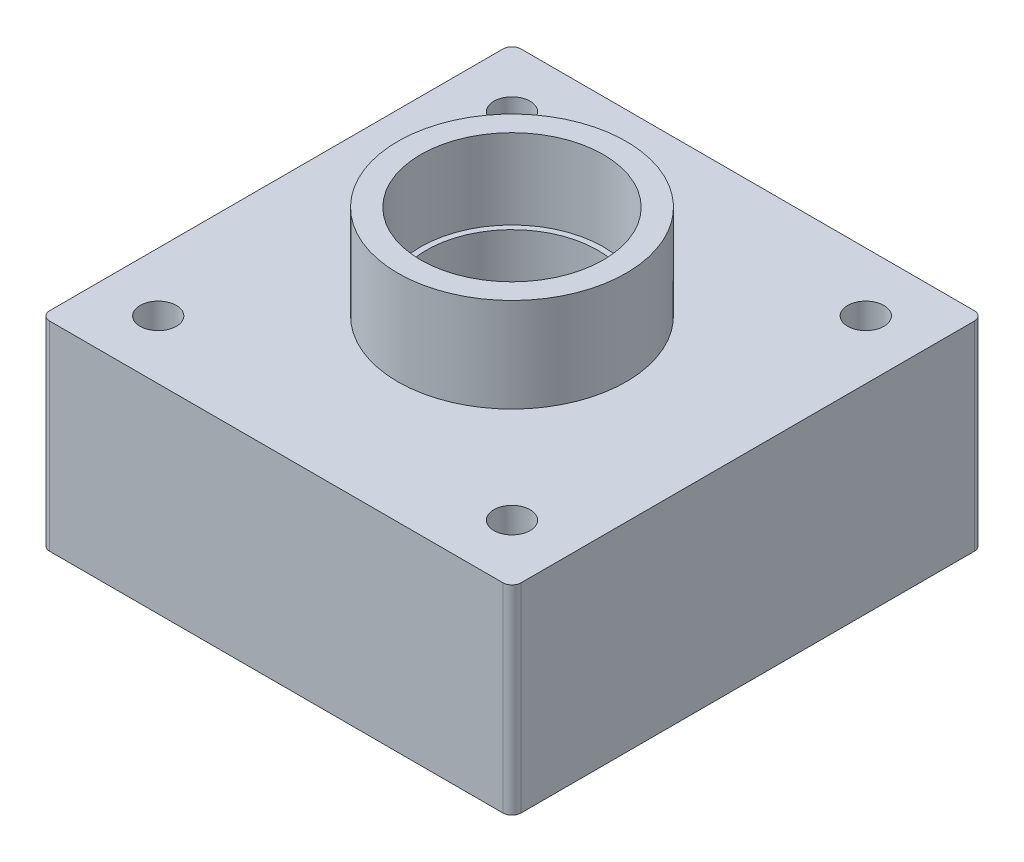
ISO-10303-21;
HEADER;
FILE_DESCRIPTION(('STEP AP214'),'2;1');
FILE_NAME('part.step','',(''),(''),'','','');
FILE_SCHEMA(('AUTOMOTIVE_DESIGN { 1 0 10303 214 1 1 1 1 }'));
ENDSEC;
DATA;
#1=APPLICATION_CONTEXT('core data for automotive mechanical design processes');
#2=APPLICATION_PROTOCOL_DEFINITION('international standard','automotive_design',2000,#1);
#3=PRODUCT_CONTEXT('',#1,'mechanical');
#4=PRODUCT('Part','Part','',(#3));
#5=PRODUCT_RELATED_PRODUCT_CATEGORY('part','',(#4));
#6=PRODUCT_DEFINITION_FORMATION('','',#4);
#7=PRODUCT_DEFINITION_CONTEXT('part definition',#1,'design');
#8=PRODUCT_DEFINITION('design','',#6,#7);
#9=PRODUCT_DEFINITION_SHAPE('','',#8);
#10=(LENGTH_UNIT() NAMED_UNIT(*) SI_UNIT(.MILLI.,.METRE.));
#11=(NAMED_UNIT(*) PLANE_ANGLE_UNIT() SI_UNIT($,.RADIAN.));
#12=(NAMED_UNIT(*) SI_UNIT($,.STERADIAN.) SOLID_ANGLE_UNIT());
#13=UNCERTAINTY_MEASURE_WITH_UNIT(LENGTH_MEASURE(1.E-05),#10,'distance_accuracy_value','');
#14=(GEOMETRIC_REPRESENTATION_CONTEXT(3) GLOBAL_UNCERTAINTY_ASSIGNED_CONTEXT((#13)) GLOBAL_UNIT_ASSIGNED_CONTEXT((#10,
#11,#12)) REPRESENTATION_CONTEXT('',''));
#15=CARTESIAN_POINT('',(0.,0.,0.));
#16=DIRECTION('',(0.,0.,1.));
#17=DIRECTION('',(1.,0.,0.));
#18=AXIS2_PLACEMENT_3D('',#15,#16,#17);
#19=CARTESIAN_POINT('',(0.,0.,0.));
#20=DIRECTION('',(0.,1.,0.));
#21=DIRECTION('',(0.,0.,1.));
#22=AXIS2_PLACEMENT_3D('',#19,#20,#21);
#23=PLANE('',#22);
#24=CARTESIAN_POINT('',(-50.55,0.,0.));
#25=DIRECTION('',(0.,-1.,0.));
#26=DIRECTION('',(0.,0.,-1.));
#27=AXIS2_PLACEMENT_3D('',#24,#25,#26);
#28=CIRCLE('',#27,6.35);
#29=CARTESIAN_POINT('',(-50.55,0.,-6.35));
#30=VERTEX_POINT('',#29);
#31=EDGE_CURVE('E266',#30,#30,#28,.T.);
#32=ORIENTED_EDGE('',*,*,#31,.F.);
#33=EDGE_LOOP('',(#32));
#34=FACE_BOUND('',#33,.T.);
#35=CARTESIAN_POINT('',(0.,0.,0.));
#36=DIRECTION('',(0.,1.,0.));
#37=DIRECTION('',(0.,0.,1.));
#38=AXIS2_PLACEMENT_3D('',#35,#36,#37);
#39=CIRCLE('',#38,20.);
#40=CARTESIAN_POINT('',(0.,0.,20.));
#41=VERTEX_POINT('',#40);
#42=EDGE_CURVE('E225',#41,#41,#39,.T.);
#43=ORIENTED_EDGE('',*,*,#42,.T.);
#44=EDGE_LOOP('',(#43));
#45=FACE_BOUND('',#44,.T.);
#46=CARTESIAN_POINT('',(0.,0.,0.));
#47=DIRECTION('',(0.,1.,0.));
#48=DIRECTION('',(0.,0.,1.));
#49=AXIS2_PLACEMENT_3D('',#46,#47,#48);
#50=CIRCLE('',#49,69.85);
#51=CARTESIAN_POINT('',(0.,0.,69.85));
#52=VERTEX_POINT('',#51);
#53=EDGE_CURVE('E235',#52,#52,#50,.T.);
#54=ORIENTED_EDGE('',*,*,#53,.F.);
#55=EDGE_LOOP('',(#54));
#56=FACE_BOUND('',#55,.T.);
#57=ADVANCED_FACE('F49',(#34,#45,#56),#23,.F.);
#58=CARTESIAN_POINT('',(0.,40.,0.));
#59=DIRECTION('',(0.,-1.,0.));
#60=DIRECTION('',(0.,0.,-1.));
#61=AXIS2_PLACEMENT_3D('',#58,#59,#60);
#62=CYLINDRICAL_SURFACE('',#61,20.);
#63=CARTESIAN_POINT('',(0.,40.,0.));
#64=DIRECTION('',(0.,1.,0.));
#65=DIRECTION('',(0.,0.,1.));
#66=AXIS2_PLACEMENT_3D('',#63,#64,#65);
#67=CIRCLE('',#66,20.);
#68=CARTESIAN_POINT('',(0.,40.,20.));
#69=VERTEX_POINT('',#68);
#70=EDGE_CURVE('E159',#69,#69,#67,.T.);
#71=ORIENTED_EDGE('',*,*,#70,.T.);
#72=EDGE_LOOP('',(#71));
#73=FACE_BOUND('',#72,.T.);
#74=ORIENTED_EDGE('',*,*,#42,.F.);
#75=EDGE_LOOP('',(#74));
#76=FACE_BOUND('',#75,.T.);
#77=ADVANCED_FACE('F329',(#73,#76),#62,.F.);
#78=CARTESIAN_POINT('',(0.,40.,0.));
#79=DIRECTION('',(0.,1.,0.));
#80=DIRECTION('',(0.,0.,1.));
#81=AXIS2_PLACEMENT_3D('',#78,#79,#80);
#82=PLANE('',#81);
#83=ORIENTED_EDGE('',*,*,#70,.F.);
#84=EDGE_LOOP('',(#83));
#85=FACE_BOUND('',#84,.T.);
#86=ADVANCED_FACE('F325',(#85),#82,.F.);
#87=CARTESIAN_POINT('',(0.,8.,0.));
#88=DIRECTION('',(0.,-1.,0.));
#89=DIRECTION('',(0.,0.,-1.));
#90=AXIS2_PLACEMENT_3D('',#87,#88,#89);
#91=CYLINDRICAL_SURFACE('',#90,69.85);
#92=CARTESIAN_POINT('',(0.,8.,0.));
#93=DIRECTION('',(0.,1.,0.));
#94=DIRECTION('',(0.,0.,1.));
#95=AXIS2_PLACEMENT_3D('',#92,#93,#94);
#96=CIRCLE('',#95,69.85);
#97=CARTESIAN_POINT('',(0.,8.,69.85));
#98=VERTEX_POINT('',#97);
#99=EDGE_CURVE('E234',#98,#98,#96,.T.);
#100=ORIENTED_EDGE('',*,*,#99,.F.);
#101=EDGE_LOOP('',(#100));
#102=FACE_BOUND('',#101,.T.);
#103=ORIENTED_EDGE('',*,*,#53,.T.);
#104=EDGE_LOOP('',(#103));
#105=FACE_BOUND('',#104,.T.);
#106=ADVANCED_FACE('F321',(#102,#105),#91,.T.);
#107=CARTESIAN_POINT('',(0.,8.,0.));
#108=DIRECTION('',(0.,-1.,0.));
#109=DIRECTION('',(0.,0.,-1.));
#110=AXIS2_PLACEMENT_3D('',#107,#108,#109);
#111=CYLINDRICAL_SURFACE('',#110,76.2);
#112=CARTESIAN_POINT('',(0.,8.,0.));
#113=DIRECTION('',(0.,1.,0.));
#114=DIRECTION('',(0.,0.,1.));
#115=AXIS2_PLACEMENT_3D('',#112,#113,#114);
#116=CIRCLE('',#115,76.2);
#117=CARTESIAN_POINT('',(0.,8.,76.2));
#118=VERTEX_POINT('',#117);
#119=EDGE_CURVE('E228',#118,#118,#116,.T.);
#120=ORIENTED_EDGE('',*,*,#119,.T.);
#121=EDGE_LOOP('',(#120));
#122=FACE_BOUND('',#121,.T.);
#123=CARTESIAN_POINT('',(0.,0.,0.));
#124=DIRECTION('',(0.,1.,0.));
#125=DIRECTION('',(0.,0.,1.));
#126=AXIS2_PLACEMENT_3D('',#123,#124,#125);
#127=CIRCLE('',#126,76.2);
#128=CARTESIAN_POINT('',(0.,0.,76.2));
#129=VERTEX_POINT('',#128);
#130=EDGE_CURVE('E231',#129,#129,#127,.T.);
#131=ORIENTED_EDGE('',*,*,#130,.F.);
#132=EDGE_LOOP('',(#131));
#133=FACE_BOUND('',#132,.T.);
#134=ADVANCED_FACE('F317',(#122,#133),#111,.F.);
#135=CARTESIAN_POINT('',(0.,8.,0.));
#136=DIRECTION('',(0.,1.,0.));
#137=DIRECTION('',(0.,0.,1.));
#138=AXIS2_PLACEMENT_3D('',#135,#136,#137);
#139=PLANE('',#138);
#140=ORIENTED_EDGE('',*,*,#99,.T.);
#141=EDGE_LOOP('',(#140));
#142=FACE_BOUND('',#141,.T.);
#143=ORIENTED_EDGE('',*,*,#119,.F.);
#144=EDGE_LOOP('',(#143));
#145=FACE_BOUND('',#144,.T.);
#146=ADVANCED_FACE('F314',(#142,#145),#139,.F.);
#147=CARTESIAN_POINT('',(0.,69.85,0.));
#148=DIRECTION('',(0.,1.,0.));
#149=DIRECTION('',(0.,0.,1.));
#150=AXIS2_PLACEMENT_3D('',#147,#148,#149);
#151=PLANE('',#150);
#152=CARTESIAN_POINT('',(0.,69.85,0.));
#153=DIRECTION('',(0.,1.,0.));
#154=DIRECTION('',(0.,0.,1.));
#155=AXIS2_PLACEMENT_3D('',#152,#153,#154);
#156=CIRCLE('',#155,40.);
#157=CARTESIAN_POINT('',(0.,69.85,40.));
#158=VERTEX_POINT('',#157);
#159=EDGE_CURVE('E243',#158,#158,#156,.T.);
#160=ORIENTED_EDGE('',*,*,#159,.F.);
#161=EDGE_LOOP('',(#160));
#162=FACE_BOUND('',#161,.T.);
#163=CARTESIAN_POINT('',(79.375,69.85,-79.375));
#164=DIRECTION('',(0.,1.,0.));
#165=DIRECTION('',(0.,0.,1.));
#166=AXIS2_PLACEMENT_3D('',#163,#164,#165);
#167=CIRCLE('',#166,3.175);
#168=CARTESIAN_POINT('',(79.375,69.85,-82.55));
#169=VERTEX_POINT('',#168);
#170=CARTESIAN_POINT('',(82.55,69.85,-79.375));
#171=VERTEX_POINT('',#170);
#172=EDGE_CURVE('E187',#169,#171,#167,.F.);
#173=ORIENTED_EDGE('',*,*,#172,.F.);
#174=DIRECTION('',(1.,0.,0.));
#175=VECTOR('',#174,1.);
#176=CARTESIAN_POINT('',(0.,69.85,-82.55));
#177=LINE('',#176,#175);
#178=CARTESIAN_POINT('',(-79.375,69.85,-82.55));
#179=VERTEX_POINT('',#178);
#180=EDGE_CURVE('E214',#179,#169,#177,.T.);
#181=ORIENTED_EDGE('',*,*,#180,.F.);
#182=CARTESIAN_POINT('',(-79.375,69.85,-79.375));
#183=DIRECTION('',(0.,1.,0.));
#184=DIRECTION('',(0.,0.,1.));
#185=AXIS2_PLACEMENT_3D('',#182,#183,#184);
#186=CIRCLE('',#185,3.175);
#187=CARTESIAN_POINT('',(-82.55,69.85,-79.375));
#188=VERTEX_POINT('',#187);
#189=EDGE_CURVE('E200',#188,#179,#186,.F.);
#190=ORIENTED_EDGE('',*,*,#189,.F.);
#191=DIRECTION('',(0.,0.,-1.));
#192=VECTOR('',#191,1.);
#193=CARTESIAN_POINT('',(-82.55,69.85,0.));
#194=LINE('',#193,#192);
#195=CARTESIAN_POINT('',(-82.55,69.85,79.375));
#196=VERTEX_POINT('',#195);
#197=EDGE_CURVE('E213',#196,#188,#194,.T.);
#198=ORIENTED_EDGE('',*,*,#197,.F.);
#199=CARTESIAN_POINT('',(-79.375,69.85,79.375));
#200=DIRECTION('',(0.,1.,0.));
#201=DIRECTION('',(0.,0.,1.));
#202=AXIS2_PLACEMENT_3D('',#199,#200,#201);
#203=CIRCLE('',#202,3.175);
#204=CARTESIAN_POINT('',(-79.375,69.85,82.55));
#205=VERTEX_POINT('',#204);
#206=EDGE_CURVE('E128',#205,#196,#203,.F.);
#207=ORIENTED_EDGE('',*,*,#206,.F.);
#208=DIRECTION('',(1.,0.,0.));
#209=VECTOR('',#208,1.);
#210=CARTESIAN_POINT('',(0.,69.85,82.55));
#211=LINE('',#210,#209);
#212=CARTESIAN_POINT('',(79.375,69.85,82.55));
#213=VERTEX_POINT('',#212);
#214=EDGE_CURVE('E120',#205,#213,#211,.T.);
#215=ORIENTED_EDGE('',*,*,#214,.T.);
#216=CARTESIAN_POINT('',(79.375,69.85,79.375));
#217=DIRECTION('',(0.,1.,0.));
#218=DIRECTION('',(0.,0.,1.));
#219=AXIS2_PLACEMENT_3D('',#216,#217,#218);
#220=CIRCLE('',#219,3.175);
#221=CARTESIAN_POINT('',(82.55,69.85,79.375));
#222=VERTEX_POINT('',#221);
#223=EDGE_CURVE('E125',#213,#222,#220,.T.);
#224=ORIENTED_EDGE('',*,*,#223,.T.);
#225=DIRECTION('',(0.,0.,-1.));
#226=VECTOR('',#225,1.);
#227=CARTESIAN_POINT('',(82.55,69.85,0.));
#228=LINE('',#227,#226);
#229=EDGE_CURVE('E66',#222,#171,#228,.T.);
#230=ORIENTED_EDGE('',*,*,#229,.T.);
#231=EDGE_LOOP('',(#173,#181,#190,#198,#207,#215,#224,#230));
#232=FACE_BOUND('',#231,.T.);
#233=CARTESIAN_POINT('',(-61.9637672353765,69.85,-61.9637672353778));
#234=DIRECTION('',(0.,1.,0.));
#235=DIRECTION('',(0.,0.,1.));
#236=AXIS2_PLACEMENT_3D('',#233,#234,#235);
#237=CIRCLE('',#236,6.35);
#238=CARTESIAN_POINT('',(-61.9637672353765,69.85,-55.6137672353778));
#239=VERTEX_POINT('',#238);
#240=EDGE_CURVE('E140',#239,#239,#237,.T.);
#241=ORIENTED_EDGE('',*,*,#240,.F.);
#242=EDGE_LOOP('',(#241));
#243=FACE_BOUND('',#242,.T.);
#244=CARTESIAN_POINT('',(-61.9637672353776,69.85,61.9637672353767));
#245=DIRECTION('',(0.,1.,0.));
#246=DIRECTION('',(0.,0.,1.));
#247=AXIS2_PLACEMENT_3D('',#244,#245,#246);
#248=CIRCLE('',#247,6.35);
#249=CARTESIAN_POINT('',(-61.9637672353776,69.85,68.3137672353767));
#250=VERTEX_POINT('',#249);
#251=EDGE_CURVE('E146',#250,#250,#248,.T.);
#252=ORIENTED_EDGE('',*,*,#251,.F.);
#253=EDGE_LOOP('',(#252));
#254=FACE_BOUND('',#253,.T.);
#255=CARTESIAN_POINT('',(61.9637672353769,69.85,61.9637672353774));
#256=DIRECTION('',(0.,1.,0.));
#257=DIRECTION('',(0.,0.,1.));
#258=AXIS2_PLACEMENT_3D('',#255,#256,#257);
#259=CIRCLE('',#258,6.35);
#260=CARTESIAN_POINT('',(61.9637672353769,69.85,68.3137672353774));
#261=VERTEX_POINT('',#260);
#262=EDGE_CURVE('E149',#261,#261,#259,.T.);
#263=ORIENTED_EDGE('',*,*,#262,.F.);
#264=EDGE_LOOP('',(#263));
#265=FACE_BOUND('',#264,.T.);
#266=CARTESIAN_POINT('',(61.9637672353771,69.85,-61.9637672353771));
#267=DIRECTION('',(0.,1.,0.));
#268=DIRECTION('',(0.,0.,1.));
#269=AXIS2_PLACEMENT_3D('',#266,#267,#268);
#270=CIRCLE('',#269,6.35);
#271=CARTESIAN_POINT('',(61.9637672353771,69.85,-55.6137672353771));
#272=VERTEX_POINT('',#271);
#273=EDGE_CURVE('E152',#272,#272,#270,.T.);
#274=ORIENTED_EDGE('',*,*,#273,.F.);
#275=EDGE_LOOP('',(#274));
#276=FACE_BOUND('',#275,.T.);
#277=ADVANCED_FACE('F122',(#162,#232,#243,#254,#265,#276),#151,.T.);
#278=CARTESIAN_POINT('',(61.9637672353771,69.85,-61.9637672353771));
#279=DIRECTION('',(0.,-1.,0.));
#280=DIRECTION('',(0.,0.,-1.));
#281=AXIS2_PLACEMENT_3D('',#278,#279,#280);
#282=CYLINDRICAL_SURFACE('',#281,6.35);
#283=ORIENTED_EDGE('',*,*,#273,.T.);
#284=EDGE_LOOP('',(#283));
#285=FACE_BOUND('',#284,.T.);
#286=CARTESIAN_POINT('',(61.9637672353771,0.,-61.9637672353771));
#287=DIRECTION('',(0.,1.,0.));
#288=DIRECTION('',(0.,0.,1.));
#289=AXIS2_PLACEMENT_3D('',#286,#287,#288);
#290=CIRCLE('',#289,6.35);
#291=CARTESIAN_POINT('',(61.9637672353771,0.,-55.6137672353771));
#292=VERTEX_POINT('',#291);
#293=EDGE_CURVE('E184',#292,#292,#290,.T.);
#294=ORIENTED_EDGE('',*,*,#293,.F.);
#295=EDGE_LOOP('',(#294));
#296=FACE_BOUND('',#295,.T.);
#297=ADVANCED_FACE('F336',(#285,#296),#282,.F.);
#298=CARTESIAN_POINT('',(61.9637672353769,69.85,61.9637672353774));
#299=DIRECTION('',(0.,-1.,0.));
#300=DIRECTION('',(0.,0.,-1.));
#301=AXIS2_PLACEMENT_3D('',#298,#299,#300);
#302=CYLINDRICAL_SURFACE('',#301,6.35);
#303=ORIENTED_EDGE('',*,*,#262,.T.);
#304=EDGE_LOOP('',(#303));
#305=FACE_BOUND('',#304,.T.);
#306=CARTESIAN_POINT('',(61.9637672353769,0.,61.9637672353774));
#307=DIRECTION('',(0.,1.,0.));
#308=DIRECTION('',(0.,0.,1.));
#309=AXIS2_PLACEMENT_3D('',#306,#307,#308);
#310=CIRCLE('',#309,6.35);
#311=CARTESIAN_POINT('',(61.9637672353769,0.,68.3137672353774));
#312=VERTEX_POINT('',#311);
#313=EDGE_CURVE('E181',#312,#312,#310,.T.);
#314=ORIENTED_EDGE('',*,*,#313,.F.);
#315=EDGE_LOOP('',(#314));
#316=FACE_BOUND('',#315,.T.);
#317=ADVANCED_FACE('F343',(#305,#316),#302,.F.);
#318=CARTESIAN_POINT('',(-61.9637672353776,69.85,61.9637672353767));
#319=DIRECTION('',(0.,-1.,0.));
#320=DIRECTION('',(0.,0.,-1.));
#321=AXIS2_PLACEMENT_3D('',#318,#319,#320);
#322=CYLINDRICAL_SURFACE('',#321,6.35);
#323=ORIENTED_EDGE('',*,*,#251,.T.);
#324=EDGE_LOOP('',(#323));
#325=FACE_BOUND('',#324,.T.);
#326=CARTESIAN_POINT('',(-61.9637672353776,0.,61.9637672353767));
#327=DIRECTION('',(0.,1.,0.));
#328=DIRECTION('',(0.,0.,1.));
#329=AXIS2_PLACEMENT_3D('',#326,#327,#328);
#330=CIRCLE('',#329,6.35);
#331=CARTESIAN_POINT('',(-61.9637672353776,0.,68.3137672353767));
#332=VERTEX_POINT('',#331);
#333=EDGE_CURVE('E178',#332,#332,#330,.T.);
#334=ORIENTED_EDGE('',*,*,#333,.F.);
#335=EDGE_LOOP('',(#334));
#336=FACE_BOUND('',#335,.T.);
#337=ADVANCED_FACE('F347',(#325,#336),#322,.F.);
#338=CARTESIAN_POINT('',(-61.9637672353765,69.85,-61.9637672353778));
#339=DIRECTION('',(0.,-1.,0.));
#340=DIRECTION('',(0.,0.,-1.));
#341=AXIS2_PLACEMENT_3D('',#338,#339,#340);
#342=CYLINDRICAL_SURFACE('',#341,6.35);
#343=ORIENTED_EDGE('',*,*,#240,.T.);
#344=EDGE_LOOP('',(#343));
#345=FACE_BOUND('',#344,.T.);
#346=CARTESIAN_POINT('',(-61.9637672353765,0.,-61.9637672353778));
#347=DIRECTION('',(0.,1.,0.));
#348=DIRECTION('',(0.,0.,1.));
#349=AXIS2_PLACEMENT_3D('',#346,#347,#348);
#350=CIRCLE('',#349,6.35);
#351=CARTESIAN_POINT('',(-61.9637672353765,0.,-55.6137672353778));
#352=VERTEX_POINT('',#351);
#353=EDGE_CURVE('E175',#352,#352,#350,.T.);
#354=ORIENTED_EDGE('',*,*,#353,.F.);
#355=EDGE_LOOP('',(#354));
#356=FACE_BOUND('',#355,.T.);
#357=ADVANCED_FACE('F351',(#345,#356),#342,.F.);
#358=CARTESIAN_POINT('',(0.,69.85,-82.55));
#359=DIRECTION('',(0.,0.,-1.));
#360=DIRECTION('',(-1.,0.,0.));
#361=AXIS2_PLACEMENT_3D('',#358,#359,#360);
#362=PLANE('',#361);
#363=DIRECTION('',(1.,0.,0.));
#364=VECTOR('',#363,1.);
#365=CARTESIAN_POINT('',(0.,0.,-82.55));
#366=LINE('',#365,#364);
#367=CARTESIAN_POINT('',(-79.375,0.,-82.55));
#368=VERTEX_POINT('',#367);
#369=CARTESIAN_POINT('',(79.375,0.,-82.55));
#370=VERTEX_POINT('',#369);
#371=EDGE_CURVE('E158',#368,#370,#366,.T.);
#372=ORIENTED_EDGE('',*,*,#371,.F.);
#373=DIRECTION('',(0.,-1.,0.));
#374=VECTOR('',#373,1.);
#375=CARTESIAN_POINT('',(-79.375,69.85,-82.55));
#376=LINE('',#375,#374);
#377=EDGE_CURVE('E58',#179,#368,#376,.T.);
#378=ORIENTED_EDGE('',*,*,#377,.F.);
#379=ORIENTED_EDGE('',*,*,#180,.T.);
#380=DIRECTION('',(0.,-1.,0.));
#381=VECTOR('',#380,1.);
#382=CARTESIAN_POINT('',(79.375,69.85,-82.55));
#383=LINE('',#382,#381);
#384=EDGE_CURVE('E11',#169,#370,#383,.T.);
#385=ORIENTED_EDGE('',*,*,#384,.T.);
#386=EDGE_LOOP('',(#372,#378,#379,#385));
#387=FACE_BOUND('',#386,.T.);
#388=ADVANCED_FACE('F204',(#387),#362,.T.);
#389=CARTESIAN_POINT('',(-79.375,69.85,-79.375));
#390=DIRECTION('',(0.,-1.,0.));
#391=DIRECTION('',(0.,0.,-1.));
#392=AXIS2_PLACEMENT_3D('',#389,#390,#391);
#393=CYLINDRICAL_SURFACE('',#392,3.175);
#394=CARTESIAN_POINT('',(-79.375,0.,-79.375));
#395=DIRECTION('',(0.,1.,0.));
#396=DIRECTION('',(0.,0.,1.));
#397=AXIS2_PLACEMENT_3D('',#394,#395,#396);
#398=CIRCLE('',#397,3.175);
#399=CARTESIAN_POINT('',(-82.55,0.,-79.375));
#400=VERTEX_POINT('',#399);
#401=EDGE_CURVE('E162',#400,#368,#398,.F.);
#402=ORIENTED_EDGE('',*,*,#401,.F.);
#403=DIRECTION('',(0.,-1.,0.));
#404=VECTOR('',#403,1.);
#405=CARTESIAN_POINT('',(-82.55,69.85,-79.375));
#406=LINE('',#405,#404);
#407=EDGE_CURVE('E193',#188,#400,#406,.T.);
#408=ORIENTED_EDGE('',*,*,#407,.F.);
#409=ORIENTED_EDGE('',*,*,#189,.T.);
#410=ORIENTED_EDGE('',*,*,#377,.T.);
#411=EDGE_LOOP('',(#402,#408,#409,#410));
#412=FACE_BOUND('',#411,.T.);
#413=ADVANCED_FACE('F198',(#412),#393,.T.);
#414=CARTESIAN_POINT('',(-82.55,69.85,0.));
#415=DIRECTION('',(-1.,0.,0.));
#416=DIRECTION('',(0.,0.,1.));
#417=AXIS2_PLACEMENT_3D('',#414,#415,#416);
#418=PLANE('',#417);
#419=CARTESIAN_POINT('',(-82.55,25.4,0.));
#420=DIRECTION('',(-1.,0.,0.));
#421=DIRECTION('',(0.,0.,1.));
#422=AXIS2_PLACEMENT_3D('',#419,#420,#421);
#423=CIRCLE('',#422,9.48689999999999);
#424=CARTESIAN_POINT('',(-82.55,25.4,9.48689999999999));
#425=VERTEX_POINT('',#424);
#426=EDGE_CURVE('E263',#425,#425,#423,.T.);
#427=ORIENTED_EDGE('',*,*,#426,.F.);
#428=EDGE_LOOP('',(#427));
#429=FACE_BOUND('',#428,.T.);
#430=DIRECTION('',(0.,0.,-1.));
#431=VECTOR('',#430,1.);
#432=CARTESIAN_POINT('',(-82.55,0.,0.));
#433=LINE('',#432,#431);
#434=CARTESIAN_POINT('',(-82.55,0.,79.375));
#435=VERTEX_POINT('',#434);
#436=EDGE_CURVE('E165',#435,#400,#433,.T.);
#437=ORIENTED_EDGE('',*,*,#436,.F.);
#438=DIRECTION('',(0.,-1.,0.));
#439=VECTOR('',#438,1.);
#440=CARTESIAN_POINT('',(-82.55,69.85,79.375));
#441=LINE('',#440,#439);
#442=EDGE_CURVE('E191',#196,#435,#441,.T.);
#443=ORIENTED_EDGE('',*,*,#442,.F.);
#444=ORIENTED_EDGE('',*,*,#197,.T.);
#445=ORIENTED_EDGE('',*,*,#407,.T.);
#446=EDGE_LOOP('',(#437,#443,#444,#445));
#447=FACE_BOUND('',#446,.T.);
#448=ADVANCED_FACE('F211',(#429,#447),#418,.T.);
#449=CARTESIAN_POINT('',(-79.375,69.85,79.375));
#450=DIRECTION('',(0.,-1.,0.));
#451=DIRECTION('',(0.,0.,-1.));
#452=AXIS2_PLACEMENT_3D('',#449,#450,#451);
#453=CYLINDRICAL_SURFACE('',#452,3.175);
#454=CARTESIAN_POINT('',(-79.375,0.,79.375));
#455=DIRECTION('',(0.,1.,0.));
#456=DIRECTION('',(0.,0.,1.));
#457=AXIS2_PLACEMENT_3D('',#454,#455,#456);
#458=CIRCLE('',#457,3.175);
#459=CARTESIAN_POINT('',(-79.375,0.,82.55));
#460=VERTEX_POINT('',#459);
#461=EDGE_CURVE('E168',#460,#435,#458,.F.);
#462=ORIENTED_EDGE('',*,*,#461,.F.);
#463=DIRECTION('',(0.,-1.,0.));
#464=VECTOR('',#463,1.);
#465=CARTESIAN_POINT('',(-79.375,69.85,82.55));
#466=LINE('',#465,#464);
#467=EDGE_CURVE('E135',#205,#460,#466,.T.);
#468=ORIENTED_EDGE('',*,*,#467,.F.);
#469=ORIENTED_EDGE('',*,*,#206,.T.);
#470=ORIENTED_EDGE('',*,*,#442,.T.);
#471=EDGE_LOOP('',(#462,#468,#469,#470));
#472=FACE_BOUND('',#471,.T.);
#473=ADVANCED_FACE('F220',(#472),#453,.T.);
#474=CARTESIAN_POINT('',(0.,69.85,82.55));
#475=DIRECTION('',(0.,0.,-1.));
#476=DIRECTION('',(-1.,0.,0.));
#477=AXIS2_PLACEMENT_3D('',#474,#475,#476);
#478=PLANE('',#477);
#479=DIRECTION('',(1.,0.,0.));
#480=VECTOR('',#479,1.);
#481=CARTESIAN_POINT('',(0.,0.,82.55));
#482=LINE('',#481,#480);
#483=CARTESIAN_POINT('',(79.375,0.,82.55));
#484=VERTEX_POINT('',#483);
#485=EDGE_CURVE('E134',#460,#484,#482,.T.);
#486=ORIENTED_EDGE('',*,*,#485,.T.);
#487=DIRECTION('',(0.,-1.,0.));
#488=VECTOR('',#487,1.);
#489=CARTESIAN_POINT('',(79.375,69.85,82.55));
#490=LINE('',#489,#488);
#491=EDGE_CURVE('E131',#213,#484,#490,.T.);
#492=ORIENTED_EDGE('',*,*,#491,.F.);
#493=ORIENTED_EDGE('',*,*,#214,.F.);
#494=ORIENTED_EDGE('',*,*,#467,.T.);
#495=EDGE_LOOP('',(#486,#492,#493,#494));
#496=FACE_BOUND('',#495,.T.);
#497=ADVANCED_FACE('F132',(#496),#478,.F.);
#498=CARTESIAN_POINT('',(79.375,69.85,79.375));
#499=DIRECTION('',(0.,-1.,0.));
#500=DIRECTION('',(0.,0.,-1.));
#501=AXIS2_PLACEMENT_3D('',#498,#499,#500);
#502=CYLINDRICAL_SURFACE('',#501,3.175);
#503=CARTESIAN_POINT('',(79.375,0.,79.375));
#504=DIRECTION('',(0.,1.,0.));
#505=DIRECTION('',(0.,0.,1.));
#506=AXIS2_PLACEMENT_3D('',#503,#504,#505);
#507=CIRCLE('',#506,3.175);
#508=CARTESIAN_POINT('',(82.55,0.,79.375));
#509=VERTEX_POINT('',#508);
#510=EDGE_CURVE('E94',#484,#509,#507,.T.);
#511=ORIENTED_EDGE('',*,*,#510,.T.);
#512=DIRECTION('',(0.,-1.,0.));
#513=VECTOR('',#512,1.);
#514=CARTESIAN_POINT('',(82.55,69.85,79.375));
#515=LINE('',#514,#513);
#516=EDGE_CURVE('E136',#222,#509,#515,.T.);
#517=ORIENTED_EDGE('',*,*,#516,.F.);
#518=ORIENTED_EDGE('',*,*,#223,.F.);
#519=ORIENTED_EDGE('',*,*,#491,.T.);
#520=EDGE_LOOP('',(#511,#517,#518,#519));
#521=FACE_BOUND('',#520,.T.);
#522=ADVANCED_FACE('F138',(#521),#502,.T.);
#523=CARTESIAN_POINT('',(82.55,69.85,0.));
#524=DIRECTION('',(-1.,0.,0.));
#525=DIRECTION('',(0.,0.,1.));
#526=AXIS2_PLACEMENT_3D('',#523,#524,#525);
#527=PLANE('',#526);
#528=DIRECTION('',(0.,0.,-1.));
#529=VECTOR('',#528,1.);
#530=CARTESIAN_POINT('',(82.55,0.,0.));
#531=LINE('',#530,#529);
#532=CARTESIAN_POINT('',(82.55,0.,-79.375));
#533=VERTEX_POINT('',#532);
#534=EDGE_CURVE('E173',#509,#533,#531,.T.);
#535=ORIENTED_EDGE('',*,*,#534,.T.);
#536=DIRECTION('',(0.,-1.,0.));
#537=VECTOR('',#536,1.);
#538=CARTESIAN_POINT('',(82.55,69.85,-79.375));
#539=LINE('',#538,#537);
#540=EDGE_CURVE('E101',#171,#533,#539,.T.);
#541=ORIENTED_EDGE('',*,*,#540,.F.);
#542=ORIENTED_EDGE('',*,*,#229,.F.);
#543=ORIENTED_EDGE('',*,*,#516,.T.);
#544=EDGE_LOOP('',(#535,#541,#542,#543));
#545=FACE_BOUND('',#544,.T.);
#546=ADVANCED_FACE('F223',(#545),#527,.F.);
#547=CARTESIAN_POINT('',(79.375,69.85,-79.375));
#548=DIRECTION('',(0.,-1.,0.));
#549=DIRECTION('',(0.,0.,-1.));
#550=AXIS2_PLACEMENT_3D('',#547,#548,#549);
#551=CYLINDRICAL_SURFACE('',#550,3.175);
#552=CARTESIAN_POINT('',(79.375,0.,-79.375));
#553=DIRECTION('',(0.,1.,0.));
#554=DIRECTION('',(0.,0.,1.));
#555=AXIS2_PLACEMENT_3D('',#552,#553,#554);
#556=CIRCLE('',#555,3.175);
#557=EDGE_CURVE('E155',#370,#533,#556,.F.);
#558=ORIENTED_EDGE('',*,*,#557,.F.);
#559=ORIENTED_EDGE('',*,*,#384,.F.);
#560=ORIENTED_EDGE('',*,*,#172,.T.);
#561=ORIENTED_EDGE('',*,*,#540,.T.);
#562=EDGE_LOOP('',(#558,#559,#560,#561));
#563=FACE_BOUND('',#562,.T.);
#564=ADVANCED_FACE('F51',(#563),#551,.T.);
#565=ORIENTED_EDGE('',*,*,#130,.T.);
#566=EDGE_LOOP('',(#565));
#567=FACE_BOUND('',#566,.T.);
#568=ORIENTED_EDGE('',*,*,#557,.T.);
#569=ORIENTED_EDGE('',*,*,#534,.F.);
#570=ORIENTED_EDGE('',*,*,#510,.F.);
#571=ORIENTED_EDGE('',*,*,#485,.F.);
#572=ORIENTED_EDGE('',*,*,#461,.T.);
#573=ORIENTED_EDGE('',*,*,#436,.T.);
#574=ORIENTED_EDGE('',*,*,#401,.T.);
#575=ORIENTED_EDGE('',*,*,#371,.T.);
#576=EDGE_LOOP('',(#568,#569,#570,#571,#572,#573,#574,#575));
#577=FACE_BOUND('',#576,.T.);
#578=ORIENTED_EDGE('',*,*,#353,.T.);
#579=EDGE_LOOP('',(#578));
#580=FACE_BOUND('',#579,.T.);
#581=ORIENTED_EDGE('',*,*,#333,.T.);
#582=EDGE_LOOP('',(#581));
#583=FACE_BOUND('',#582,.T.);
#584=ORIENTED_EDGE('',*,*,#313,.T.);
#585=EDGE_LOOP('',(#584));
#586=FACE_BOUND('',#585,.T.);
#587=ORIENTED_EDGE('',*,*,#293,.T.);
#588=EDGE_LOOP('',(#587));
#589=FACE_BOUND('',#588,.T.);
#590=ADVANCED_FACE('F206',(#567,#577,#580,#583,#586,#589),#23,.F.);
#591=CARTESIAN_POINT('',(0.,102.8,0.));
#592=DIRECTION('',(0.,-1.,0.));
#593=DIRECTION('',(0.,0.,-1.));
#594=AXIS2_PLACEMENT_3D('',#591,#592,#593);
#595=CYLINDRICAL_SURFACE('',#594,40.);
#596=CARTESIAN_POINT('',(0.,102.8,0.));
#597=DIRECTION('',(0.,1.,0.));
#598=DIRECTION('',(0.,0.,1.));
#599=AXIS2_PLACEMENT_3D('',#596,#597,#598);
#600=CIRCLE('',#599,40.);
#601=CARTESIAN_POINT('',(0.,102.8,40.));
#602=VERTEX_POINT('',#601);
#603=EDGE_CURVE('E238',#602,#602,#600,.T.);
#604=ORIENTED_EDGE('',*,*,#603,.F.);
#605=EDGE_LOOP('',(#604));
#606=FACE_BOUND('',#605,.T.);
#607=ORIENTED_EDGE('',*,*,#159,.T.);
#608=EDGE_LOOP('',(#607));
#609=FACE_BOUND('',#608,.T.);
#610=ADVANCED_FACE('F309',(#606,#609),#595,.T.);
#611=CARTESIAN_POINT('',(0.,102.8,0.));
#612=DIRECTION('',(0.,1.,0.));
#613=DIRECTION('',(0.,0.,1.));
#614=AXIS2_PLACEMENT_3D('',#611,#612,#613);
#615=PLANE('',#614);
#616=CARTESIAN_POINT('',(0.,102.8,0.));
#617=DIRECTION('',(0.,1.,0.));
#618=DIRECTION('',(0.,0.,1.));
#619=AXIS2_PLACEMENT_3D('',#616,#617,#618);
#620=CIRCLE('',#619,32.);
#621=CARTESIAN_POINT('',(0.,102.8,32.));
#622=VERTEX_POINT('',#621);
#623=EDGE_CURVE('E249',#622,#622,#620,.T.);
#624=ORIENTED_EDGE('',*,*,#623,.F.);
#625=EDGE_LOOP('',(#624));
#626=FACE_BOUND('',#625,.T.);
#627=ORIENTED_EDGE('',*,*,#603,.T.);
#628=EDGE_LOOP('',(#627));
#629=FACE_BOUND('',#628,.T.);
#630=ADVANCED_FACE('F305',(#626,#629),#615,.T.);
#631=CARTESIAN_POINT('',(0.,74.8,0.));
#632=DIRECTION('',(0.,1.,0.));
#633=DIRECTION('',(0.,0.,1.));
#634=AXIS2_PLACEMENT_3D('',#631,#632,#633);
#635=CYLINDRICAL_SURFACE('',#634,32.);
#636=CARTESIAN_POINT('',(0.,74.8,0.));
#637=DIRECTION('',(0.,1.,0.));
#638=DIRECTION('',(0.,0.,1.));
#639=AXIS2_PLACEMENT_3D('',#636,#637,#638);
#640=CIRCLE('',#639,32.);
#641=CARTESIAN_POINT('',(0.,74.8,32.));
#642=VERTEX_POINT('',#641);
#643=EDGE_CURVE('E246',#642,#642,#640,.T.);
#644=ORIENTED_EDGE('',*,*,#643,.F.);
#645=EDGE_LOOP('',(#644));
#646=FACE_BOUND('',#645,.T.);
#647=ORIENTED_EDGE('',*,*,#623,.T.);
#648=EDGE_LOOP('',(#647));
#649=FACE_BOUND('',#648,.T.);
#650=ADVANCED_FACE('F301',(#646,#649),#635,.F.);
#651=CARTESIAN_POINT('',(0.,74.8,0.));
#652=DIRECTION('',(0.,1.,0.));
#653=DIRECTION('',(0.,0.,1.));
#654=AXIS2_PLACEMENT_3D('',#651,#652,#653);
#655=PLANE('',#654);
#656=CARTESIAN_POINT('',(0.,74.8,0.));
#657=DIRECTION('',(0.,1.,0.));
#658=DIRECTION('',(0.,0.,1.));
#659=AXIS2_PLACEMENT_3D('',#656,#657,#658);
#660=CIRCLE('',#659,30.);
#661=CARTESIAN_POINT('',(0.,74.8,30.));
#662=VERTEX_POINT('',#661);
#663=EDGE_CURVE('E255',#662,#662,#660,.T.);
#664=ORIENTED_EDGE('',*,*,#663,.F.);
#665=EDGE_LOOP('',(#664));
#666=FACE_BOUND('',#665,.T.);
#667=ORIENTED_EDGE('',*,*,#643,.T.);
#668=EDGE_LOOP('',(#667));
#669=FACE_BOUND('',#668,.T.);
#670=ADVANCED_FACE('F297',(#666,#669),#655,.T.);
#671=CARTESIAN_POINT('',(0.,52.8,0.));
#672=DIRECTION('',(0.,1.,0.));
#673=DIRECTION('',(0.,0.,1.));
#674=AXIS2_PLACEMENT_3D('',#671,#672,#673);
#675=CYLINDRICAL_SURFACE('',#674,30.);
#676=CARTESIAN_POINT('',(0.,52.8,0.));
#677=DIRECTION('',(0.,1.,0.));
#678=DIRECTION('',(0.,0.,1.));
#679=AXIS2_PLACEMENT_3D('',#676,#677,#678);
#680=CIRCLE('',#679,30.);
#681=CARTESIAN_POINT('',(0.,52.8,30.));
#682=VERTEX_POINT('',#681);
#683=EDGE_CURVE('E252',#682,#682,#680,.T.);
#684=ORIENTED_EDGE('',*,*,#683,.F.);
#685=EDGE_LOOP('',(#684));
#686=FACE_BOUND('',#685,.T.);
#687=ORIENTED_EDGE('',*,*,#663,.T.);
#688=EDGE_LOOP('',(#687));
#689=FACE_BOUND('',#688,.T.);
#690=ADVANCED_FACE('F293',(#686,#689),#675,.F.);
#691=CARTESIAN_POINT('',(0.,52.8,0.));
#692=DIRECTION('',(0.,1.,0.));
#693=DIRECTION('',(0.,0.,1.));
#694=AXIS2_PLACEMENT_3D('',#691,#692,#693);
#695=PLANE('',#694);
#696=ORIENTED_EDGE('',*,*,#683,.T.);
#697=EDGE_LOOP('',(#696));
#698=FACE_BOUND('',#697,.T.);
#699=ADVANCED_FACE('F289',(#698),#695,.T.);
#700=CARTESIAN_POINT('',(-40.64,25.4,0.));
#701=DIRECTION('',(1.,0.,0.));
#702=DIRECTION('',(0.,0.,-1.));
#703=AXIS2_PLACEMENT_3D('',#700,#701,#702);
#704=PLANE('',#703);
#705=CARTESIAN_POINT('',(-40.64,25.4,0.));
#706=DIRECTION('',(-1.,0.,0.));
#707=DIRECTION('',(0.,0.,1.));
#708=AXIS2_PLACEMENT_3D('',#705,#706,#707);
#709=CIRCLE('',#708,9.48689999999999);
#710=CARTESIAN_POINT('',(-40.64,25.4,9.48689999999999));
#711=VERTEX_POINT('',#710);
#712=EDGE_CURVE('E258',#711,#711,#709,.T.);
#713=ORIENTED_EDGE('',*,*,#712,.T.);
#714=EDGE_LOOP('',(#713));
#715=FACE_BOUND('',#714,.T.);
#716=ADVANCED_FACE('F285',(#715),#704,.F.);
#717=CARTESIAN_POINT('',(-82.55,25.4,0.));
#718=DIRECTION('',(-1.,0.,0.));
#719=DIRECTION('',(0.,0.,1.));
#720=AXIS2_PLACEMENT_3D('',#717,#718,#719);
#721=CYLINDRICAL_SURFACE('',#720,9.48689999999999);
#722=CARTESIAN_POINT('',(-50.55,18.3516830654404,-6.35));
#723=CARTESIAN_POINT('',(-50.7048050240406,18.3516904499146,-6.35000421083799));
#724=CARTESIAN_POINT('',(-50.8595738365244,18.3465639335466,-6.34433061516717));
#725=CARTESIAN_POINT('',(-51.1676876752185,18.3263379776537,-6.3217732089403));
#726=CARTESIAN_POINT('',(-51.3210322548788,18.3112355106706,-6.30488599531603));
#727=CARTESIAN_POINT('',(-51.6251266776819,18.271753933248,-6.26021238311609));
#728=CARTESIAN_POINT('',(-51.7758724116301,18.24736132928,-6.23241012909021));
#729=CARTESIAN_POINT('',(-52.0735209704046,18.1903877890379,-6.16641385002237));
#730=CARTESIAN_POINT('',(-52.2204217505803,18.1578025900471,-6.12821441433074));
#731=CARTESIAN_POINT('',(-52.65105771682,18.0504024967458,-5.99975438140398));
#732=CARTESIAN_POINT('',(-52.9281083314261,17.9654542354134,-5.89511517361874));
#733=CARTESIAN_POINT('',(-53.4600525826901,17.7786588036222,-5.6515447004794));
#734=CARTESIAN_POINT('',(-53.7149422291392,17.6768085994353,-5.51260727675503));
#735=CARTESIAN_POINT('',(-54.2395756664464,17.4484244267389,-5.17886600816185));
#736=CARTESIAN_POINT('',(-54.5053584208141,17.3205267748464,-4.97871386256488));
#737=CARTESIAN_POINT('',(-54.8783276368045,17.1294580341759,-4.64926357318588));
#738=CARTESIAN_POINT('',(-54.9984504132587,17.0658486374146,-4.53447523481065));
#739=CARTESIAN_POINT('',(-55.2297601945651,16.9401251826118,-4.29534758876708));
#740=CARTESIAN_POINT('',(-55.3409452984203,16.8780114446467,-4.17100626016808));
#741=CARTESIAN_POINT('',(-55.5693976593555,16.7476544630035,-3.89421367963331));
#742=CARTESIAN_POINT('',(-55.685165836389,16.6798480936708,-3.7403141744196));
#743=CARTESIAN_POINT('',(-55.9031263163599,16.5497404507722,-3.4210912557294));
#744=CARTESIAN_POINT('',(-56.0053248748984,16.4874366449884,-3.25577316003824));
#745=CARTESIAN_POINT('',(-56.1949955851383,16.3700941621042,-2.91454982340438));
#746=CARTESIAN_POINT('',(-56.2824758313649,16.3150514952675,-2.73865047449884));
#747=CARTESIAN_POINT('',(-56.4414947593121,16.2138845309519,-2.37733503340834));
#748=CARTESIAN_POINT('',(-56.5130368913092,16.1677583035323,-2.19192101166969));
#749=CARTESIAN_POINT('',(-56.6318176187492,16.0905703503827,-1.83448995314391));
#750=CARTESIAN_POINT('',(-56.6808874260467,16.0583962153236,-1.66332113623714));
#751=CARTESIAN_POINT('',(-56.7646912582314,16.0031833739245,-1.31605580400775));
#752=CARTESIAN_POINT('',(-56.799426255593,15.9801440478825,-1.13995962382352));
#753=CARTESIAN_POINT('',(-56.8538953255832,15.9439197061921,-0.784648729538466));
#754=CARTESIAN_POINT('',(-56.8736452994802,15.9307242450354,-0.60543752814361));
#755=CARTESIAN_POINT('',(-56.8978126963214,15.9145683137998,-0.245533837130101));
#756=CARTESIAN_POINT('',(-56.9022323109623,15.9116063806903,-0.0648415629549409));
#757=CARTESIAN_POINT('',(-56.8961663442071,15.9156654970713,0.268392943492829));
#758=CARTESIAN_POINT('',(-56.8878644715562,15.9212240173763,0.420998897924634));
#759=CARTESIAN_POINT('',(-56.8603443100789,15.9396030380641,0.724782327459583));
#760=CARTESIAN_POINT('',(-56.841126269093,15.9524233735748,0.875959834914943));
#761=CARTESIAN_POINT('',(-56.7920406913067,15.9850380777804,1.175801833823));
#762=CARTESIAN_POINT('',(-56.7621732598867,16.0048323774648,1.32446635012764));
#763=CARTESIAN_POINT('',(-56.6921786418682,16.0509659230094,1.61831958975797));
#764=CARTESIAN_POINT('',(-56.6520510113196,16.0773054520747,1.7635081623852));
#765=CARTESIAN_POINT('',(-56.5622215772922,16.1358527834395,2.04889267955106));
#766=CARTESIAN_POINT('',(-56.5125657796793,16.1680323487527,2.18910892625355));
#767=CARTESIAN_POINT('',(-56.404077090589,16.2377257487217,2.46459403933644));
#768=CARTESIAN_POINT('',(-56.3452411841337,16.2752413355014,2.59986126225153));
#769=CARTESIAN_POINT('',(-56.1557888356296,16.3947803472011,2.99727429853571));
#770=CARTESIAN_POINT('',(-56.0121612997935,16.4838402340412,3.25123964017121));
#771=CARTESIAN_POINT('',(-55.6735059568221,16.6874573992818,3.76553622849946));
#772=CARTESIAN_POINT('',(-55.4741986829275,16.8038281381998,4.02229525863215));
#773=CARTESIAN_POINT('',(-55.0408060005101,17.0445524913119,4.50106599678385));
#774=CARTESIAN_POINT('',(-54.80666685273,17.1689182689885,4.72302290493601));
#775=CARTESIAN_POINT('',(-54.4124214634014,17.3637465381232,5.04369743327409));
#776=CARTESIAN_POINT('',(-54.2626634195048,17.4348525835371,5.15495014135));
#777=CARTESIAN_POINT('',(-53.953078337007,17.5743631680772,5.36437584817573));
#778=CARTESIAN_POINT('',(-53.7932490233842,17.6427670910965,5.46254587593692));
#779=CARTESIAN_POINT('',(-53.2996710464957,17.8403295610452,5.73611116011524));
#780=CARTESIAN_POINT('',(-52.9510584962138,17.9622430666269,5.89119502310396));
#781=CARTESIAN_POINT('',(-52.3254964591602,18.1357755634908,6.10291615381535));
#782=CARTESIAN_POINT('',(-52.0566154440554,18.1975269454213,6.17502761668744));
#783=CARTESIAN_POINT('',(-51.6445637940429,18.2684891911471,6.25652149840991));
#784=CARTESIAN_POINT('',(-51.5058155024554,18.2885287763446,6.27923681113034));
#785=CARTESIAN_POINT('',(-51.2261830048474,18.320681760941,6.31546766623187));
#786=CARTESIAN_POINT('',(-51.0852987911667,18.3327951319068,6.32898317561121));
#787=CARTESIAN_POINT('',(-50.801814265378,18.3486131203973,6.34660176120429));
#788=CARTESIAN_POINT('',(-50.6592090329186,18.3522786501274,6.35066108498596));
#789=CARTESIAN_POINT('',(-50.3740913299445,18.3509296831257,6.34916376256242));
#790=CARTESIAN_POINT('',(-50.2315788594833,18.345915181403,6.34360711082833));
#791=CARTESIAN_POINT('',(-49.9477165828625,18.3274155961597,6.32297502957257));
#792=CARTESIAN_POINT('',(-49.8063675114361,18.3139255221316,6.30789399196368));
#793=CARTESIAN_POINT('',(-49.5259869716897,18.2790460370599,6.26848980179153));
#794=CARTESIAN_POINT('',(-49.3869555520315,18.2576564603747,6.24416645542956));
#795=CARTESIAN_POINT('',(-48.9888679969719,18.1854033260721,6.16085600116186));
#796=CARTESIAN_POINT('',(-48.7338082582982,18.1252976230804,6.09033194188645));
#797=CARTESIAN_POINT('',(-48.2390158973987,17.9863169521229,5.92034746727374));
#798=CARTESIAN_POINT('',(-47.9992952825016,17.9074275030408,5.82086471332442));
#799=CARTESIAN_POINT('',(-47.5987397678528,17.7603747326579,5.62566612685677));
#800=CARTESIAN_POINT('',(-47.4338904151406,17.6949449626176,5.53599484576879));
#801=CARTESIAN_POINT('',(-47.1139212546405,17.5600796963092,5.34328950963843));
#802=CARTESIAN_POINT('',(-46.9588017249729,17.4906440856456,5.2402550728774));
#803=CARTESIAN_POINT('',(-46.6584620462869,17.3498312389796,5.02125839466027));
#804=CARTESIAN_POINT('',(-46.5132596718526,17.2784508217466,4.90527387443811));
#805=CARTESIAN_POINT('',(-46.2335323153671,17.1358489934729,4.66101672832869));
#806=CARTESIAN_POINT('',(-46.0990061447329,17.0646275655923,4.5327454738439));
#807=CARTESIAN_POINT('',(-45.8401896025401,16.9236080922018,4.263257460008));
#808=CARTESIAN_POINT('',(-45.7159895317375,16.8538259515262,4.12194551778011));
#809=CARTESIAN_POINT('',(-45.4798417353847,16.7180678052433,3.82773634461054));
#810=CARTESIAN_POINT('',(-45.3678925331299,16.6520913413589,3.6748405137448));
#811=CARTESIAN_POINT('',(-45.1573728453552,16.5257606990802,3.35829447766404));
#812=CARTESIAN_POINT('',(-45.0587808335432,16.4653975248303,3.19466222250812));
#813=CARTESIAN_POINT('',(-44.8758961791685,16.3518461833503,2.8572434777093));
#814=CARTESIAN_POINT('',(-44.7915993552472,16.2986559189714,2.6834599773821));
#815=CARTESIAN_POINT('',(-44.6551470152022,16.211641009979,2.36564435305175));
#816=CARTESIAN_POINT('',(-44.5999881673946,16.1761202717629,2.22335866185092));
#817=CARTESIAN_POINT('',(-44.4997308725897,16.1111319699929,1.9339550002734));
#818=CARTESIAN_POINT('',(-44.454630313894,16.0816631359684,1.78683805165521));
#819=CARTESIAN_POINT('',(-44.375037396121,16.0294058899028,1.48866885638215));
#820=CARTESIAN_POINT('',(-44.3405400793317,16.0066143560196,1.33761848480706));
#821=CARTESIAN_POINT('',(-44.2825807370595,15.9682003699287,1.0325051063889));
#822=CARTESIAN_POINT('',(-44.2591189609383,15.9525780797194,0.878442031551911));
#823=CARTESIAN_POINT('',(-44.2235116513172,15.9288306222548,0.567929281558331));
#824=CARTESIAN_POINT('',(-44.2114028186167,15.9207297704591,0.411473516597497));
#825=CARTESIAN_POINT('',(-44.1988156701004,15.9123083947056,0.0978841140568824));
#826=CARTESIAN_POINT('',(-44.1983373441358,15.9119878639585,-0.0592495229312617));
#827=CARTESIAN_POINT('',(-44.2090190254667,15.9191352908171,-0.372951440252036));
#828=CARTESIAN_POINT('',(-44.2201798018095,15.9266037630771,-0.529519682540557));
#829=CARTESIAN_POINT('',(-44.2539703781058,15.9491480320585,-0.840851187175195));
#830=CARTESIAN_POINT('',(-44.2765999287372,15.9642236634063,-0.995614488684476));
#831=CARTESIAN_POINT('',(-44.3315863215807,16.0006895003907,-1.29450575257532));
#832=CARTESIAN_POINT('',(-44.3633981900658,16.0217249604652,-1.43877774773748));
#833=CARTESIAN_POINT('',(-44.4366847935643,16.0699067233076,-1.72382267120937));
#834=CARTESIAN_POINT('',(-44.478162841871,16.0970551213098,-1.86459438136826));
#835=CARTESIAN_POINT('',(-44.6164113192088,16.1868965673203,-2.28039216236632));
#836=CARTESIAN_POINT('',(-44.7270400826314,16.2580156970022,-2.54913536561073));
#837=CARTESIAN_POINT('',(-44.9915777973426,16.4242891348222,-3.08599787527065));
#838=CARTESIAN_POINT('',(-45.1482996436997,16.5209399536979,-3.35224510067191));
#839=CARTESIAN_POINT('',(-45.4955050398942,16.7277892394783,-3.8559432770799));
#840=CARTESIAN_POINT('',(-45.6860156431141,16.837998540324,-4.09337089480983));
#841=CARTESIAN_POINT('',(-46.1309839459892,17.0833660516858,-4.57371472570613));
#842=CARTESIAN_POINT('',(-46.3908051994785,17.2196501032178,-4.81113494290702));
#843=CARTESIAN_POINT('',(-46.8079743089259,17.4208530229815,-5.13328718847408));
#844=CARTESIAN_POINT('',(-46.9516991730035,17.4874229114171,-5.23505971383859));
#845=CARTESIAN_POINT('',(-47.2480077922341,17.6177011600115,-5.42683299018222));
#846=CARTESIAN_POINT('',(-47.400591074523,17.6814096725898,-5.51683436867486));
#847=CARTESIAN_POINT('',(-47.8244842328178,17.8470602210558,-5.74330366835285));
#848=CARTESIAN_POINT('',(-48.1040734881389,17.9445144977616,-5.86814434647908));
#849=CARTESIAN_POINT('',(-48.5392556700819,18.0717895668849,-6.02521129368791));
#850=CARTESIAN_POINT('',(-48.6868334603422,18.1110412780223,-6.07251053756594));
#851=CARTESIAN_POINT('',(-48.9867503212112,18.1818771910526,-6.15653978983812));
#852=CARTESIAN_POINT('',(-49.1390876672286,18.2134641346709,-6.19327357842189));
#853=CARTESIAN_POINT('',(-49.4980630783753,18.2764589797045,-6.2657389588752));
#854=CARTESIAN_POINT('',(-49.7061941275515,18.3044427060084,-6.29722925640437));
#855=CARTESIAN_POINT('',(-50.1262397124351,18.3420485277276,-6.33935556871272));
#856=CARTESIAN_POINT('',(-50.3381537631581,18.3516729599992,-6.34999423758895));
#857=CARTESIAN_POINT('',(-50.55,18.3516830654404,-6.35));
#858=B_SPLINE_CURVE_WITH_KNOTS('',3,(#722,#723,#724,#725,#726,#727,#728,#729,#730,#731,#732,
#733,#734,#735,#736,#737,#738,#739,#740,#741,#742,#743,#744,#745,#746,#747,#748,#749,#750,#751,
#752,#753,#754,#755,#756,#757,#758,#759,#760,#761,#762,#763,#764,#765,#766,#767,#768,#769,#770,
#771,#772,#773,#774,#775,#776,#777,#778,#779,#780,#781,#782,#783,#784,#785,#786,#787,#788,#789,
#790,#791,#792,#793,#794,#795,#796,#797,#798,#799,#800,#801,#802,#803,#804,#805,#806,#807,#808,
#809,#810,#811,#812,#813,#814,#815,#816,#817,#818,#819,#820,#821,#822,#823,#824,#825,#826,#827,
#828,#829,#830,#831,#832,#833,#834,#835,#836,#837,#838,#839,#840,#841,#842,#843,#844,#845,#846,
#847,#848,#849,#850,#851,#852,#853,#854,#855,#856,#857),.UNSPECIFIED.,.T.,.F.,(4,2,2,2,2,2,2,2,
2,2,2,2,2,2,2,2,2,2,2,2,2,2,2,2,2,2,2,2,2,2,2,2,2,2,2,2,2,2,2,2,2,2,2,2,2,2,2,2,2,2,2,2,2,2,2,2,
2,2,2,2,2,2,2,2,2,2,2,4),(0.,0.464166937454342,0.92847480302933,1.3934596438851,1.8586869250787,
2.77890764519013,3.6992937146341,4.76432662570875,5.29767792969167,5.83114237623189,
6.44283649278906,7.0542476316582,7.66532141010737,8.27626277472927,8.81828519554761,
9.36027083948151,9.9016805511086,10.4430128571906,10.9012547609618,11.359486261233,
11.8177132272224,12.2759600236545,12.7320474961858,13.1882850757986,14.1000982315159,
15.1320815869265,16.1656739421023,16.763981275528,17.3624242498257,18.5561138444848,
19.4079508562695,19.8335288152815,20.2591083009299,20.6866530048786,21.114197954652,
21.5419948836848,21.9698007835351,22.780661815345,23.5921500069637,24.1876577314613,
24.7831824703893,25.3797479868577,25.9762469941805,26.5775085876068,27.1786976256855,
27.7789059670023,28.3789384427469,28.848512147256,29.3179871736085,29.7872423544586,
30.2565081382103,30.7272857450005,31.1980629409859,31.6688712452907,32.1396693150349,
32.5868475917696,33.0341793746223,33.928129708244,34.8956612938186,35.8639710716146,
36.9912210002696,37.5555317006401,38.1198123056374,39.0794661154847,39.5585786013519,
40.0375194528317,40.6727994649719,41.3079986103196),.UNSPECIFIED.);
#859=CARTESIAN_POINT('',(-50.55,18.3516830654404,-6.35));
#860=VERTEX_POINT('',#859);
#861=EDGE_CURVE('E269',#860,#860,#858,.T.);
#862=ORIENTED_EDGE('',*,*,#861,.F.);
#863=EDGE_LOOP('',(#862));
#864=FACE_BOUND('',#863,.T.);
#865=ORIENTED_EDGE('',*,*,#712,.F.);
#866=EDGE_LOOP('',(#865));
#867=FACE_BOUND('',#866,.T.);
#868=ORIENTED_EDGE('',*,*,#426,.T.);
#869=EDGE_LOOP('',(#868));
#870=FACE_BOUND('',#869,.T.);
#871=ADVANCED_FACE('F281',(#864,#867,#870),#721,.F.);
#872=CARTESIAN_POINT('',(-50.55,102.801,0.));
#873=DIRECTION('',(0.,-1.,0.));
#874=DIRECTION('',(0.,0.,-1.));
#875=AXIS2_PLACEMENT_3D('',#872,#873,#874);
#876=CYLINDRICAL_SURFACE('',#875,6.35);
#877=ORIENTED_EDGE('',*,*,#31,.T.);
#878=EDGE_LOOP('',(#877));
#879=FACE_BOUND('',#878,.T.);
#880=ORIENTED_EDGE('',*,*,#861,.T.);
#881=EDGE_LOOP('',(#880));
#882=FACE_BOUND('',#881,.T.);
#883=ADVANCED_FACE('F276',(#879,#882),#876,.F.);
#884=CLOSED_SHELL('',(#57,#77,#86,#106,#134,#146,#277,#297,#317,#337,#357,#388,#413,#448,#473,
#497,#522,#546,#564,#590,#610,#630,#650,#670,#690,#699,#716,#871,#883));
#885=MANIFOLD_SOLID_BREP('B2',#884);
#886=ADVANCED_BREP_SHAPE_REPRESENTATION('',(#18,#885),#14);
#887=SHAPE_DEFINITION_REPRESENTATION(#9,#886);
ENDSEC;
END-ISO-10303-21;
